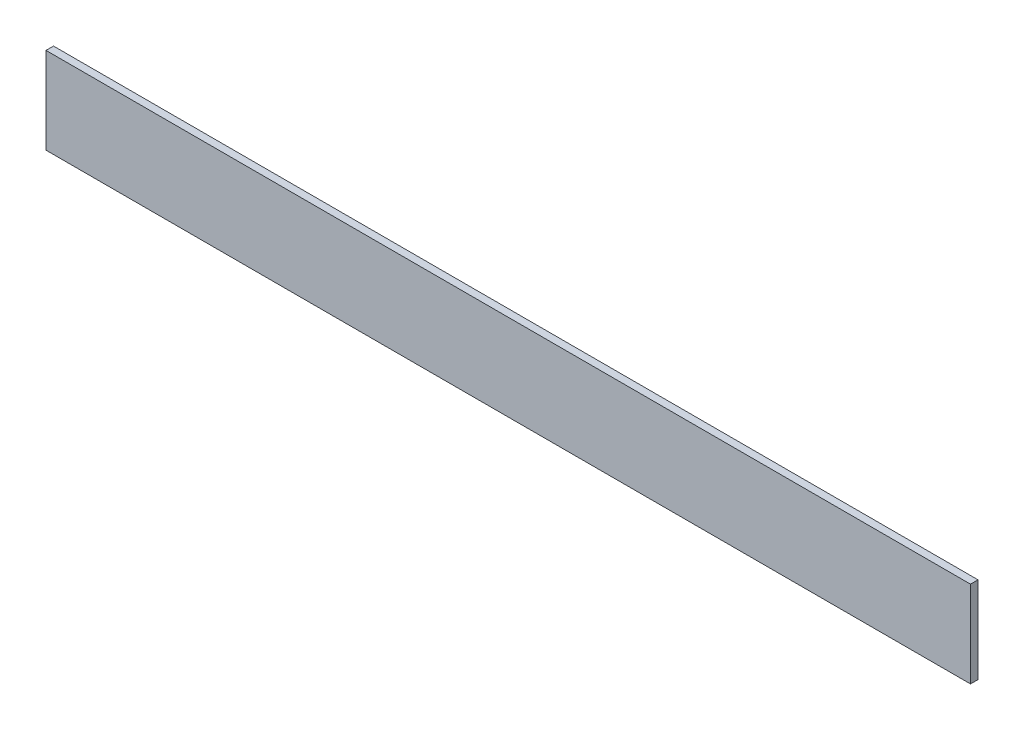
ISO-10303-21;
HEADER;
FILE_DESCRIPTION(('STEP AP214'),'2;1');
FILE_NAME('part.step','',(''),(''),'','','');
FILE_SCHEMA(('AUTOMOTIVE_DESIGN { 1 0 10303 214 1 1 1 1 }'));
ENDSEC;
DATA;
#1=APPLICATION_CONTEXT('core data for automotive mechanical design processes');
#2=APPLICATION_PROTOCOL_DEFINITION('international standard','automotive_design',2000,#1);
#3=PRODUCT_CONTEXT('',#1,'mechanical');
#4=PRODUCT('Part','Part','',(#3));
#5=PRODUCT_RELATED_PRODUCT_CATEGORY('part','',(#4));
#6=PRODUCT_DEFINITION_FORMATION('','',#4);
#7=PRODUCT_DEFINITION_CONTEXT('part definition',#1,'design');
#8=PRODUCT_DEFINITION('design','',#6,#7);
#9=PRODUCT_DEFINITION_SHAPE('','',#8);
#10=(LENGTH_UNIT() NAMED_UNIT(*) SI_UNIT(.MILLI.,.METRE.));
#11=(NAMED_UNIT(*) PLANE_ANGLE_UNIT() SI_UNIT($,.RADIAN.));
#12=(NAMED_UNIT(*) SI_UNIT($,.STERADIAN.) SOLID_ANGLE_UNIT());
#13=UNCERTAINTY_MEASURE_WITH_UNIT(LENGTH_MEASURE(1.E-05),#10,'distance_accuracy_value','');
#14=(GEOMETRIC_REPRESENTATION_CONTEXT(3) GLOBAL_UNCERTAINTY_ASSIGNED_CONTEXT((#13)) GLOBAL_UNIT_ASSIGNED_CONTEXT((#10,
#11,#12)) REPRESENTATION_CONTEXT('',''));
#15=CARTESIAN_POINT('',(0.,0.,0.));
#16=DIRECTION('',(0.,0.,1.));
#17=DIRECTION('',(1.,0.,0.));
#18=AXIS2_PLACEMENT_3D('',#15,#16,#17);
#19=CARTESIAN_POINT('',(1230.,115.,10.));
#20=DIRECTION('',(0.,-1.,0.));
#21=DIRECTION('',(1.,0.,0.));
#22=AXIS2_PLACEMENT_3D('',#19,#20,#21);
#23=PLANE('',#22);
#24=DIRECTION('',(-1.,0.,0.));
#25=VECTOR('',#24,1.);
#26=CARTESIAN_POINT('',(1230.,115.,0.));
#27=LINE('',#26,#25);
#28=CARTESIAN_POINT('',(1230.,115.,0.));
#29=VERTEX_POINT('',#28);
#30=CARTESIAN_POINT('',(0.,115.,0.));
#31=VERTEX_POINT('',#30);
#32=EDGE_CURVE('E107',#29,#31,#27,.T.);
#33=ORIENTED_EDGE('',*,*,#32,.T.);
#34=DIRECTION('',(0.,0.,-1.));
#35=VECTOR('',#34,1.);
#36=CARTESIAN_POINT('',(0.,115.,10.));
#37=LINE('',#36,#35);
#38=CARTESIAN_POINT('',(0.,115.,10.));
#39=VERTEX_POINT('',#38);
#40=EDGE_CURVE('E11',#39,#31,#37,.T.);
#41=ORIENTED_EDGE('',*,*,#40,.F.);
#42=DIRECTION('',(-1.,0.,0.));
#43=VECTOR('',#42,1.);
#44=CARTESIAN_POINT('',(1230.,115.,10.));
#45=LINE('',#44,#43);
#46=CARTESIAN_POINT('',(1230.,115.,10.));
#47=VERTEX_POINT('',#46);
#48=EDGE_CURVE('E91',#47,#39,#45,.T.);
#49=ORIENTED_EDGE('',*,*,#48,.F.);
#50=DIRECTION('',(0.,0.,-1.));
#51=VECTOR('',#50,1.);
#52=CARTESIAN_POINT('',(1230.,115.,10.));
#53=LINE('',#52,#51);
#54=EDGE_CURVE('E103',#47,#29,#53,.T.);
#55=ORIENTED_EDGE('',*,*,#54,.T.);
#56=EDGE_LOOP('',(#33,#41,#49,#55));
#57=FACE_BOUND('',#56,.T.);
#58=ADVANCED_FACE('F39',(#57),#23,.F.);
#59=CARTESIAN_POINT('',(0.,115.,10.));
#60=DIRECTION('',(1.,0.,0.));
#61=DIRECTION('',(0.,1.,0.));
#62=AXIS2_PLACEMENT_3D('',#59,#60,#61);
#63=PLANE('',#62);
#64=DIRECTION('',(0.,-1.,0.));
#65=VECTOR('',#64,1.);
#66=CARTESIAN_POINT('',(0.,115.,0.));
#67=LINE('',#66,#65);
#68=CARTESIAN_POINT('',(0.,0.,0.));
#69=VERTEX_POINT('',#68);
#70=EDGE_CURVE('E96',#31,#69,#67,.T.);
#71=ORIENTED_EDGE('',*,*,#70,.T.);
#72=DIRECTION('',(0.,0.,-1.));
#73=VECTOR('',#72,1.);
#74=CARTESIAN_POINT('',(0.,0.,10.));
#75=LINE('',#74,#73);
#76=CARTESIAN_POINT('',(0.,0.,10.));
#77=VERTEX_POINT('',#76);
#78=EDGE_CURVE('E48',#77,#69,#75,.T.);
#79=ORIENTED_EDGE('',*,*,#78,.F.);
#80=DIRECTION('',(0.,-1.,0.));
#81=VECTOR('',#80,1.);
#82=CARTESIAN_POINT('',(0.,115.,10.));
#83=LINE('',#82,#81);
#84=EDGE_CURVE('E86',#39,#77,#83,.T.);
#85=ORIENTED_EDGE('',*,*,#84,.F.);
#86=ORIENTED_EDGE('',*,*,#40,.T.);
#87=EDGE_LOOP('',(#71,#79,#85,#86));
#88=FACE_BOUND('',#87,.T.);
#89=ADVANCED_FACE('F95',(#88),#63,.F.);
#90=CARTESIAN_POINT('',(1230.,-2.33295215237571E-13,10.));
#91=DIRECTION('',(0.,1.,0.));
#92=DIRECTION('',(-1.,0.,0.));
#93=AXIS2_PLACEMENT_3D('',#90,#91,#92);
#94=PLANE('',#93);
#95=DIRECTION('',(1.,0.,0.));
#96=VECTOR('',#95,1.);
#97=CARTESIAN_POINT('',(1230.,-2.33295215237571E-13,0.));
#98=LINE('',#97,#96);
#99=CARTESIAN_POINT('',(1230.,-2.33295215237571E-13,0.));
#100=VERTEX_POINT('',#99);
#101=EDGE_CURVE('E73',#69,#100,#98,.T.);
#102=ORIENTED_EDGE('',*,*,#101,.T.);
#103=DIRECTION('',(0.,0.,-1.));
#104=VECTOR('',#103,1.);
#105=CARTESIAN_POINT('',(1230.,-2.33295215237571E-13,10.));
#106=LINE('',#105,#104);
#107=CARTESIAN_POINT('',(1230.,-2.33295215237571E-13,10.));
#108=VERTEX_POINT('',#107);
#109=EDGE_CURVE('E98',#108,#100,#106,.T.);
#110=ORIENTED_EDGE('',*,*,#109,.F.);
#111=DIRECTION('',(1.,0.,0.));
#112=VECTOR('',#111,1.);
#113=CARTESIAN_POINT('',(1230.,-2.33295215237571E-13,10.));
#114=LINE('',#113,#112);
#115=EDGE_CURVE('E89',#77,#108,#114,.T.);
#116=ORIENTED_EDGE('',*,*,#115,.F.);
#117=ORIENTED_EDGE('',*,*,#78,.T.);
#118=EDGE_LOOP('',(#102,#110,#116,#117));
#119=FACE_BOUND('',#118,.T.);
#120=ADVANCED_FACE('F99',(#119),#94,.F.);
#121=CARTESIAN_POINT('',(1230.,115.,10.));
#122=DIRECTION('',(-1.,0.,0.));
#123=DIRECTION('',(0.,0.,1.));
#124=AXIS2_PLACEMENT_3D('',#121,#122,#123);
#125=PLANE('',#124);
#126=DIRECTION('',(0.,1.,0.));
#127=VECTOR('',#126,1.);
#128=CARTESIAN_POINT('',(1230.,115.,0.));
#129=LINE('',#128,#127);
#130=EDGE_CURVE('E79',#100,#29,#129,.T.);
#131=ORIENTED_EDGE('',*,*,#130,.T.);
#132=ORIENTED_EDGE('',*,*,#54,.F.);
#133=DIRECTION('',(0.,1.,0.));
#134=VECTOR('',#133,1.);
#135=CARTESIAN_POINT('',(1230.,115.,10.));
#136=LINE('',#135,#134);
#137=EDGE_CURVE('E56',#108,#47,#136,.T.);
#138=ORIENTED_EDGE('',*,*,#137,.F.);
#139=ORIENTED_EDGE('',*,*,#109,.T.);
#140=EDGE_LOOP('',(#131,#132,#138,#139));
#141=FACE_BOUND('',#140,.T.);
#142=ADVANCED_FACE('F120',(#141),#125,.F.);
#143=CARTESIAN_POINT('',(0.,0.,10.));
#144=DIRECTION('',(0.,0.,1.));
#145=DIRECTION('',(1.,0.,0.));
#146=AXIS2_PLACEMENT_3D('',#143,#144,#145);
#147=PLANE('',#146);
#148=ORIENTED_EDGE('',*,*,#48,.T.);
#149=ORIENTED_EDGE('',*,*,#84,.T.);
#150=ORIENTED_EDGE('',*,*,#115,.T.);
#151=ORIENTED_EDGE('',*,*,#137,.T.);
#152=EDGE_LOOP('',(#148,#149,#150,#151));
#153=FACE_BOUND('',#152,.T.);
#154=ADVANCED_FACE('F87',(#153),#147,.T.);
#155=CARTESIAN_POINT('',(0.,0.,0.));
#156=DIRECTION('',(0.,0.,1.));
#157=DIRECTION('',(1.,0.,0.));
#158=AXIS2_PLACEMENT_3D('',#155,#156,#157);
#159=PLANE('',#158);
#160=ORIENTED_EDGE('',*,*,#32,.F.);
#161=ORIENTED_EDGE('',*,*,#130,.F.);
#162=ORIENTED_EDGE('',*,*,#101,.F.);
#163=ORIENTED_EDGE('',*,*,#70,.F.);
#164=EDGE_LOOP('',(#160,#161,#162,#163));
#165=FACE_BOUND('',#164,.T.);
#166=ADVANCED_FACE('F123',(#165),#159,.F.);
#167=CLOSED_SHELL('',(#58,#89,#120,#142,#154,#166));
#168=MANIFOLD_SOLID_BREP('B2',#167);
#169=ADVANCED_BREP_SHAPE_REPRESENTATION('',(#18,#168),#14);
#170=SHAPE_DEFINITION_REPRESENTATION(#9,#169);
ENDSEC;
END-ISO-10303-21;
